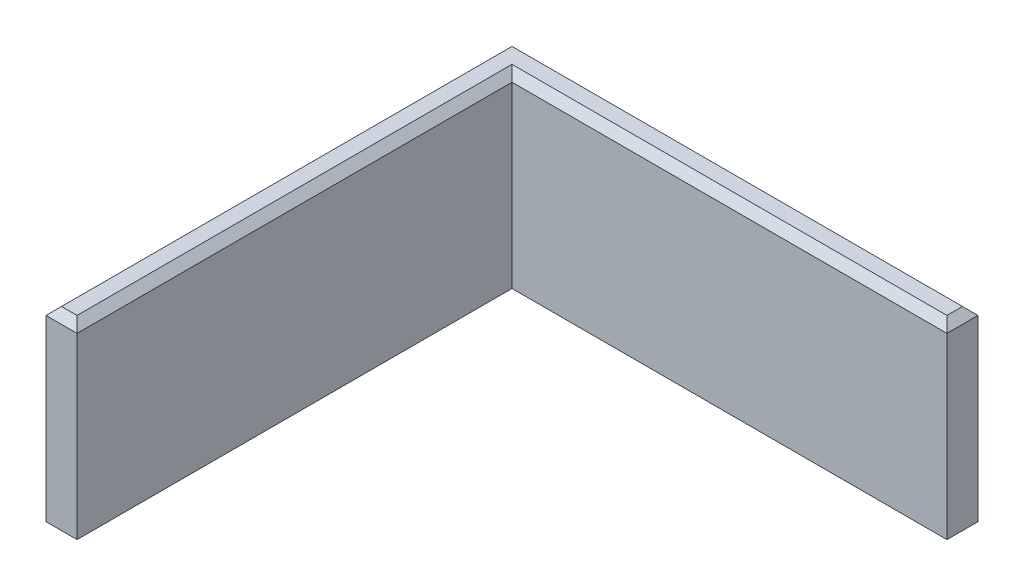
ISO-10303-21;
HEADER;
FILE_DESCRIPTION(('STEP AP214'),'2;1');
FILE_NAME('part.step','',(''),(''),'','','');
FILE_SCHEMA(('AUTOMOTIVE_DESIGN { 1 0 10303 214 1 1 1 1 }'));
ENDSEC;
DATA;
#1=APPLICATION_CONTEXT('core data for automotive mechanical design processes');
#2=APPLICATION_PROTOCOL_DEFINITION('international standard','automotive_design',2000,#1);
#3=PRODUCT_CONTEXT('',#1,'mechanical');
#4=PRODUCT('Part','Part','',(#3));
#5=PRODUCT_RELATED_PRODUCT_CATEGORY('part','',(#4));
#6=PRODUCT_DEFINITION_FORMATION('','',#4);
#7=PRODUCT_DEFINITION_CONTEXT('part definition',#1,'design');
#8=PRODUCT_DEFINITION('design','',#6,#7);
#9=PRODUCT_DEFINITION_SHAPE('','',#8);
#10=(LENGTH_UNIT() NAMED_UNIT(*) SI_UNIT(.MILLI.,.METRE.));
#11=(NAMED_UNIT(*) PLANE_ANGLE_UNIT() SI_UNIT($,.RADIAN.));
#12=(NAMED_UNIT(*) SI_UNIT($,.STERADIAN.) SOLID_ANGLE_UNIT());
#13=UNCERTAINTY_MEASURE_WITH_UNIT(LENGTH_MEASURE(1.E-05),#10,'distance_accuracy_value','');
#14=(GEOMETRIC_REPRESENTATION_CONTEXT(3) GLOBAL_UNCERTAINTY_ASSIGNED_CONTEXT((#13)) GLOBAL_UNIT_ASSIGNED_CONTEXT((#10,
#11,#12)) REPRESENTATION_CONTEXT('',''));
#15=CARTESIAN_POINT('',(0.,0.,0.));
#16=DIRECTION('',(0.,0.,1.));
#17=DIRECTION('',(1.,0.,0.));
#18=AXIS2_PLACEMENT_3D('',#15,#16,#17);
#19=CARTESIAN_POINT('',(0.,25.,0.));
#20=DIRECTION('',(0.,0.,-1.));
#21=DIRECTION('',(-1.,0.,0.));
#22=AXIS2_PLACEMENT_3D('',#19,#20,#21);
#23=PLANE('',#22);
#24=DIRECTION('',(0.,-1.,0.));
#25=VECTOR('',#24,1.);
#26=CARTESIAN_POINT('',(56.,25.,0.));
#27=LINE('',#26,#25);
#28=CARTESIAN_POINT('',(56.,24.,0.));
#29=VERTEX_POINT('',#28);
#30=CARTESIAN_POINT('',(56.,0.999999999999987,0.));
#31=VERTEX_POINT('',#30);
#32=EDGE_CURVE('E174',#29,#31,#27,.T.);
#33=ORIENTED_EDGE('',*,*,#32,.F.);
#34=DIRECTION('',(-1.,0.,0.));
#35=VECTOR('',#34,1.);
#36=CARTESIAN_POINT('',(0.,24.,0.));
#37=LINE('',#36,#35);
#38=CARTESIAN_POINT('',(0.,24.,0.));
#39=VERTEX_POINT('',#38);
#40=EDGE_CURVE('E209',#29,#39,#37,.T.);
#41=ORIENTED_EDGE('',*,*,#40,.T.);
#42=DIRECTION('',(0.,-1.,0.));
#43=VECTOR('',#42,1.);
#44=CARTESIAN_POINT('',(0.,25.,0.));
#45=LINE('',#44,#43);
#46=CARTESIAN_POINT('',(0.,0.999999999999987,0.));
#47=VERTEX_POINT('',#46);
#48=EDGE_CURVE('E167',#39,#47,#45,.T.);
#49=ORIENTED_EDGE('',*,*,#48,.T.);
#50=DIRECTION('',(1.,0.,0.));
#51=VECTOR('',#50,1.);
#52=CARTESIAN_POINT('',(0.,0.999999999999987,0.));
#53=LINE('',#52,#51);
#54=EDGE_CURVE('E206',#47,#31,#53,.T.);
#55=ORIENTED_EDGE('',*,*,#54,.T.);
#56=EDGE_LOOP('',(#33,#41,#49,#55));
#57=FACE_BOUND('',#56,.T.);
#58=ADVANCED_FACE('F47',(#57),#23,.F.);
#59=CARTESIAN_POINT('',(56.,25.,0.));
#60=DIRECTION('',(-1.,0.,0.));
#61=DIRECTION('',(0.,0.,1.));
#62=AXIS2_PLACEMENT_3D('',#59,#60,#61);
#63=PLANE('',#62);
#64=DIRECTION('',(0.,-1.,0.));
#65=VECTOR('',#64,1.);
#66=CARTESIAN_POINT('',(56.,25.,-4.00000000000001));
#67=LINE('',#66,#65);
#68=CARTESIAN_POINT('',(56.,24.,-4.00000000000001));
#69=VERTEX_POINT('',#68);
#70=CARTESIAN_POINT('',(56.,0.999999999999987,-4.00000000000001));
#71=VERTEX_POINT('',#70);
#72=EDGE_CURVE('E180',#69,#71,#67,.T.);
#73=ORIENTED_EDGE('',*,*,#72,.F.);
#74=DIRECTION('',(0.,0.,1.));
#75=VECTOR('',#74,1.);
#76=CARTESIAN_POINT('',(56.,24.,0.));
#77=LINE('',#76,#75);
#78=EDGE_CURVE('E165',#69,#29,#77,.T.);
#79=ORIENTED_EDGE('',*,*,#78,.T.);
#80=ORIENTED_EDGE('',*,*,#32,.T.);
#81=DIRECTION('',(0.,0.,-1.));
#82=VECTOR('',#81,1.);
#83=CARTESIAN_POINT('',(56.,0.999999999999987,0.));
#84=LINE('',#83,#82);
#85=EDGE_CURVE('E212',#31,#71,#84,.T.);
#86=ORIENTED_EDGE('',*,*,#85,.T.);
#87=EDGE_LOOP('',(#73,#79,#80,#86));
#88=FACE_BOUND('',#87,.T.);
#89=ADVANCED_FACE('F355',(#88),#63,.F.);
#90=CARTESIAN_POINT('',(-3.99999999999996,25.,-4.));
#91=DIRECTION('',(0.,0.,1.));
#92=DIRECTION('',(1.,0.,0.));
#93=AXIS2_PLACEMENT_3D('',#90,#91,#92);
#94=PLANE('',#93);
#95=DIRECTION('',(-1.,0.,0.));
#96=VECTOR('',#95,1.);
#97=CARTESIAN_POINT('',(-3.99999999999996,0.999999999999987,-4.));
#98=LINE('',#97,#96);
#99=CARTESIAN_POINT('',(-2.,0.999999999999987,-4.));
#100=VERTEX_POINT('',#99);
#101=EDGE_CURVE('E224',#71,#100,#98,.T.);
#102=ORIENTED_EDGE('',*,*,#101,.T.);
#103=DIRECTION('',(0.,-1.,0.));
#104=VECTOR('',#103,1.);
#105=CARTESIAN_POINT('',(-2.,25.,-4.));
#106=LINE('',#105,#104);
#107=CARTESIAN_POINT('',(-2.,24.,-4.));
#108=VERTEX_POINT('',#107);
#109=EDGE_CURVE('E70',#100,#108,#106,.F.);
#110=ORIENTED_EDGE('',*,*,#109,.T.);
#111=DIRECTION('',(1.,0.,0.));
#112=VECTOR('',#111,1.);
#113=CARTESIAN_POINT('',(56.,24.,-4.00000000000001));
#114=LINE('',#113,#112);
#115=EDGE_CURVE('E227',#108,#69,#114,.T.);
#116=ORIENTED_EDGE('',*,*,#115,.T.);
#117=ORIENTED_EDGE('',*,*,#72,.T.);
#118=EDGE_LOOP('',(#102,#110,#116,#117));
#119=FACE_BOUND('',#118,.T.);
#120=ADVANCED_FACE('F306',(#119),#94,.F.);
#121=CARTESIAN_POINT('',(-4.,25.,0.));
#122=DIRECTION('',(1.,0.,0.));
#123=DIRECTION('',(0.,0.,-1.));
#124=AXIS2_PLACEMENT_3D('',#121,#122,#123);
#125=PLANE('',#124);
#126=DIRECTION('',(0.,0.,-1.));
#127=VECTOR('',#126,1.);
#128=CARTESIAN_POINT('',(-4.,24.,-4.));
#129=LINE('',#128,#127);
#130=CARTESIAN_POINT('',(-3.99999999999998,24.,56.));
#131=VERTEX_POINT('',#130);
#132=CARTESIAN_POINT('',(-4.,24.,-2.));
#133=VERTEX_POINT('',#132);
#134=EDGE_CURVE('E220',#131,#133,#129,.T.);
#135=ORIENTED_EDGE('',*,*,#134,.T.);
#136=DIRECTION('',(0.,-1.,0.));
#137=VECTOR('',#136,1.);
#138=CARTESIAN_POINT('',(-4.,25.,-2.));
#139=LINE('',#138,#137);
#140=CARTESIAN_POINT('',(-4.,0.999999999999987,-2.));
#141=VERTEX_POINT('',#140);
#142=EDGE_CURVE('E249',#133,#141,#139,.T.);
#143=ORIENTED_EDGE('',*,*,#142,.T.);
#144=DIRECTION('',(0.,0.,1.));
#145=VECTOR('',#144,1.);
#146=CARTESIAN_POINT('',(-4.,0.999999999999987,0.));
#147=LINE('',#146,#145);
#148=CARTESIAN_POINT('',(-3.99999999999998,0.999999999999987,56.));
#149=VERTEX_POINT('',#148);
#150=EDGE_CURVE('E217',#141,#149,#147,.T.);
#151=ORIENTED_EDGE('',*,*,#150,.T.);
#152=DIRECTION('',(0.,-1.,0.));
#153=VECTOR('',#152,1.);
#154=CARTESIAN_POINT('',(-3.99999999999998,25.,56.));
#155=LINE('',#154,#153);
#156=EDGE_CURVE('E320',#131,#149,#155,.T.);
#157=ORIENTED_EDGE('',*,*,#156,.F.);
#158=EDGE_LOOP('',(#135,#143,#151,#157));
#159=FACE_BOUND('',#158,.T.);
#160=ADVANCED_FACE('F317',(#159),#125,.F.);
#161=CARTESIAN_POINT('',(0.,25.,56.));
#162=DIRECTION('',(0.,0.,-1.));
#163=DIRECTION('',(-1.,0.,0.));
#164=AXIS2_PLACEMENT_3D('',#161,#162,#163);
#165=PLANE('',#164);
#166=DIRECTION('',(0.,-1.,0.));
#167=VECTOR('',#166,1.);
#168=CARTESIAN_POINT('',(0.,25.,56.));
#169=LINE('',#168,#167);
#170=CARTESIAN_POINT('',(0.,24.,56.));
#171=VERTEX_POINT('',#170);
#172=CARTESIAN_POINT('',(0.,0.999999999999987,56.));
#173=VERTEX_POINT('',#172);
#174=EDGE_CURVE('E324',#171,#173,#169,.T.);
#175=ORIENTED_EDGE('',*,*,#174,.F.);
#176=DIRECTION('',(-1.,0.,0.));
#177=VECTOR('',#176,1.);
#178=CARTESIAN_POINT('',(-3.99999999999998,24.,56.));
#179=LINE('',#178,#177);
#180=EDGE_CURVE('E196',#171,#131,#179,.T.);
#181=ORIENTED_EDGE('',*,*,#180,.T.);
#182=ORIENTED_EDGE('',*,*,#156,.T.);
#183=DIRECTION('',(1.,0.,0.));
#184=VECTOR('',#183,1.);
#185=CARTESIAN_POINT('',(0.,0.999999999999987,56.));
#186=LINE('',#185,#184);
#187=EDGE_CURVE('E193',#149,#173,#186,.T.);
#188=ORIENTED_EDGE('',*,*,#187,.T.);
#189=EDGE_LOOP('',(#175,#181,#182,#188));
#190=FACE_BOUND('',#189,.T.);
#191=ADVANCED_FACE('F366',(#190),#165,.F.);
#192=CARTESIAN_POINT('',(0.,25.,0.));
#193=DIRECTION('',(-1.,0.,0.));
#194=DIRECTION('',(0.,0.,1.));
#195=AXIS2_PLACEMENT_3D('',#192,#193,#194);
#196=PLANE('',#195);
#197=ORIENTED_EDGE('',*,*,#48,.F.);
#198=DIRECTION('',(0.,0.,1.));
#199=VECTOR('',#198,1.);
#200=CARTESIAN_POINT('',(0.,24.,56.));
#201=LINE('',#200,#199);
#202=EDGE_CURVE('E203',#39,#171,#201,.T.);
#203=ORIENTED_EDGE('',*,*,#202,.T.);
#204=ORIENTED_EDGE('',*,*,#174,.T.);
#205=DIRECTION('',(0.,0.,-1.));
#206=VECTOR('',#205,1.);
#207=CARTESIAN_POINT('',(0.,0.999999999999987,0.));
#208=LINE('',#207,#206);
#209=EDGE_CURVE('E200',#173,#47,#208,.T.);
#210=ORIENTED_EDGE('',*,*,#209,.T.);
#211=EDGE_LOOP('',(#197,#203,#204,#210));
#212=FACE_BOUND('',#211,.T.);
#213=ADVANCED_FACE('F364',(#212),#196,.F.);
#214=CARTESIAN_POINT('',(0.,25.,0.));
#215=DIRECTION('',(0.,1.,0.));
#216=DIRECTION('',(0.,0.,1.));
#217=AXIS2_PLACEMENT_3D('',#214,#215,#216);
#218=PLANE('',#217);
#219=DIRECTION('',(0.,0.,1.));
#220=VECTOR('',#219,1.);
#221=CARTESIAN_POINT('',(-3.,25.,56.));
#222=LINE('',#221,#220);
#223=CARTESIAN_POINT('',(-3.00000000000001,25.,-3.00000000000001));
#224=VERTEX_POINT('',#223);
#225=CARTESIAN_POINT('',(-3.,25.,55.));
#226=VERTEX_POINT('',#225);
#227=EDGE_CURVE('E159',#224,#226,#222,.T.);
#228=ORIENTED_EDGE('',*,*,#227,.T.);
#229=DIRECTION('',(1.,0.,0.));
#230=VECTOR('',#229,1.);
#231=CARTESIAN_POINT('',(0.,25.,55.));
#232=LINE('',#231,#230);
#233=CARTESIAN_POINT('',(-0.999999999999969,25.,55.));
#234=VERTEX_POINT('',#233);
#235=EDGE_CURVE('E189',#226,#234,#232,.T.);
#236=ORIENTED_EDGE('',*,*,#235,.T.);
#237=DIRECTION('',(0.,0.,-1.));
#238=VECTOR('',#237,1.);
#239=CARTESIAN_POINT('',(-0.999999999999986,25.,0.));
#240=LINE('',#239,#238);
#241=CARTESIAN_POINT('',(-0.999999999999987,25.,-0.999999999999987));
#242=VERTEX_POINT('',#241);
#243=EDGE_CURVE('E186',#234,#242,#240,.T.);
#244=ORIENTED_EDGE('',*,*,#243,.T.);
#245=DIRECTION('',(1.,0.,0.));
#246=VECTOR('',#245,1.);
#247=CARTESIAN_POINT('',(56.,25.,-0.999999999999987));
#248=LINE('',#247,#246);
#249=CARTESIAN_POINT('',(55.,25.,-0.999999999999987));
#250=VERTEX_POINT('',#249);
#251=EDGE_CURVE('E154',#242,#250,#248,.T.);
#252=ORIENTED_EDGE('',*,*,#251,.T.);
#253=DIRECTION('',(0.,0.,-1.));
#254=VECTOR('',#253,1.);
#255=CARTESIAN_POINT('',(55.,25.,-4.00000000000001));
#256=LINE('',#255,#254);
#257=CARTESIAN_POINT('',(55.,25.,-3.00000000000002));
#258=VERTEX_POINT('',#257);
#259=EDGE_CURVE('E148',#250,#258,#256,.T.);
#260=ORIENTED_EDGE('',*,*,#259,.T.);
#261=DIRECTION('',(-1.,0.,0.));
#262=VECTOR('',#261,1.);
#263=CARTESIAN_POINT('',(-3.99999999999996,25.,-3.00000000000001));
#264=LINE('',#263,#262);
#265=EDGE_CURVE('E152',#258,#224,#264,.T.);
#266=ORIENTED_EDGE('',*,*,#265,.T.);
#267=EDGE_LOOP('',(#228,#236,#244,#252,#260,#266));
#268=FACE_BOUND('',#267,.T.);
#269=ADVANCED_FACE('F150',(#268),#218,.T.);
#270=CARTESIAN_POINT('',(0.,0.,0.));
#271=DIRECTION('',(0.,1.,0.));
#272=DIRECTION('',(0.,0.,1.));
#273=AXIS2_PLACEMENT_3D('',#270,#271,#272);
#274=PLANE('',#273);
#275=DIRECTION('',(0.,0.,-1.));
#276=VECTOR('',#275,1.);
#277=CARTESIAN_POINT('',(-3.00000000000001,0.,0.));
#278=LINE('',#277,#276);
#279=CARTESIAN_POINT('',(-3.,0.,55.));
#280=VERTEX_POINT('',#279);
#281=CARTESIAN_POINT('',(-3.00000000000001,0.,-3.00000000000001));
#282=VERTEX_POINT('',#281);
#283=EDGE_CURVE('E236',#280,#282,#278,.T.);
#284=ORIENTED_EDGE('',*,*,#283,.T.);
#285=DIRECTION('',(1.,0.,0.));
#286=VECTOR('',#285,1.);
#287=CARTESIAN_POINT('',(0.,0.,-3.00000000000001));
#288=LINE('',#287,#286);
#289=CARTESIAN_POINT('',(55.,0.,-3.00000000000002));
#290=VERTEX_POINT('',#289);
#291=EDGE_CURVE('E245',#282,#290,#288,.T.);
#292=ORIENTED_EDGE('',*,*,#291,.T.);
#293=DIRECTION('',(0.,0.,1.));
#294=VECTOR('',#293,1.);
#295=CARTESIAN_POINT('',(55.,0.,0.));
#296=LINE('',#295,#294);
#297=CARTESIAN_POINT('',(55.,0.,-0.999999999999987));
#298=VERTEX_POINT('',#297);
#299=EDGE_CURVE('E242',#290,#298,#296,.T.);
#300=ORIENTED_EDGE('',*,*,#299,.T.);
#301=DIRECTION('',(-1.,0.,0.));
#302=VECTOR('',#301,1.);
#303=CARTESIAN_POINT('',(0.,0.,-0.999999999999987));
#304=LINE('',#303,#302);
#305=CARTESIAN_POINT('',(-0.999999999999987,0.,-0.999999999999987));
#306=VERTEX_POINT('',#305);
#307=EDGE_CURVE('E239',#298,#306,#304,.T.);
#308=ORIENTED_EDGE('',*,*,#307,.T.);
#309=DIRECTION('',(0.,0.,1.));
#310=VECTOR('',#309,1.);
#311=CARTESIAN_POINT('',(-0.999999999999986,0.,0.));
#312=LINE('',#311,#310);
#313=CARTESIAN_POINT('',(-0.999999999999969,0.,55.));
#314=VERTEX_POINT('',#313);
#315=EDGE_CURVE('E230',#306,#314,#312,.T.);
#316=ORIENTED_EDGE('',*,*,#315,.T.);
#317=DIRECTION('',(-1.,0.,0.));
#318=VECTOR('',#317,1.);
#319=CARTESIAN_POINT('',(0.,0.,55.));
#320=LINE('',#319,#318);
#321=EDGE_CURVE('E233',#314,#280,#320,.T.);
#322=ORIENTED_EDGE('',*,*,#321,.T.);
#323=EDGE_LOOP('',(#284,#292,#300,#308,#316,#322));
#324=FACE_BOUND('',#323,.T.);
#325=ADVANCED_FACE('F393',(#324),#274,.F.);
#326=CARTESIAN_POINT('',(55.,25.,0.));
#327=DIRECTION('',(0.707106781186552,0.707106781186543,0.));
#328=DIRECTION('',(0.,0.,1.));
#329=AXIS2_PLACEMENT_3D('',#326,#327,#328);
#330=PLANE('',#329);
#331=DIRECTION('',(0.577350269189623,-0.577350269189631,0.577350269189623));
#332=VECTOR('',#331,1.);
#333=CARTESIAN_POINT('',(55.3333333333334,24.6666666666667,-0.666666666666661));
#334=LINE('',#333,#332);
#335=EDGE_CURVE('E168',#29,#250,#334,.F.);
#336=ORIENTED_EDGE('',*,*,#335,.F.);
#337=ORIENTED_EDGE('',*,*,#78,.F.);
#338=DIRECTION('',(0.577350269189623,-0.577350269189631,-0.577350269189623));
#339=VECTOR('',#338,1.);
#340=CARTESIAN_POINT('',(36.6666666666669,43.3333333333334,15.3333333333332));
#341=LINE('',#340,#339);
#342=EDGE_CURVE('E163',#258,#69,#341,.T.);
#343=ORIENTED_EDGE('',*,*,#342,.F.);
#344=ORIENTED_EDGE('',*,*,#259,.F.);
#345=EDGE_LOOP('',(#336,#337,#343,#344));
#346=FACE_BOUND('',#345,.T.);
#347=ADVANCED_FACE('F164',(#346),#330,.T.);
#348=CARTESIAN_POINT('',(0.,25.,-3.00000000000001));
#349=DIRECTION('',(0.,0.707106781186543,-0.707106781186552));
#350=DIRECTION('',(1.,0.,0.));
#351=AXIS2_PLACEMENT_3D('',#348,#349,#350);
#352=PLANE('',#351);
#353=ORIENTED_EDGE('',*,*,#115,.F.);
#354=CARTESIAN_POINT('',(-2.,26.,-2.));
#355=DIRECTION('',(0.,0.707106781186543,-0.707106781186552));
#356=DIRECTION('',(0.,-0.707106781186552,-0.707106781186543));
#357=AXIS2_PLACEMENT_3D('',#354,#355,#356);
#358=ELLIPSE('',#357,2.82842712474621,2.);
#359=CARTESIAN_POINT('',(-3.4142135623731,24.5857864376269,-3.41421356237309));
#360=VERTEX_POINT('',#359);
#361=EDGE_CURVE('E56',#108,#360,#358,.T.);
#362=ORIENTED_EDGE('',*,*,#361,.T.);
#363=DIRECTION('',(0.577350269189623,0.577350269189631,0.577350269189623));
#364=VECTOR('',#363,1.);
#365=CARTESIAN_POINT('',(-2.00000000000002,26.,-2.00000000000002));
#366=LINE('',#365,#364);
#367=EDGE_CURVE('E171',#224,#360,#366,.F.);
#368=ORIENTED_EDGE('',*,*,#367,.F.);
#369=ORIENTED_EDGE('',*,*,#265,.F.);
#370=ORIENTED_EDGE('',*,*,#342,.T.);
#371=EDGE_LOOP('',(#353,#362,#368,#369,#370));
#372=FACE_BOUND('',#371,.T.);
#373=ADVANCED_FACE('F170',(#372),#352,.T.);
#374=CARTESIAN_POINT('',(0.,25.,-0.999999999999987));
#375=DIRECTION('',(0.,0.707106781186543,0.707106781186552));
#376=DIRECTION('',(-1.,0.,0.));
#377=AXIS2_PLACEMENT_3D('',#374,#375,#376);
#378=PLANE('',#377);
#379=ORIENTED_EDGE('',*,*,#335,.T.);
#380=ORIENTED_EDGE('',*,*,#251,.F.);
#381=DIRECTION('',(0.577350269189623,-0.577350269189631,0.577350269189623));
#382=VECTOR('',#381,1.);
#383=CARTESIAN_POINT('',(-0.666666666666661,24.6666666666667,-0.666666666666661));
#384=LINE('',#383,#382);
#385=EDGE_CURVE('E257',#39,#242,#384,.F.);
#386=ORIENTED_EDGE('',*,*,#385,.F.);
#387=ORIENTED_EDGE('',*,*,#40,.F.);
#388=EDGE_LOOP('',(#379,#380,#386,#387));
#389=FACE_BOUND('',#388,.T.);
#390=ADVANCED_FACE('F357',(#389),#378,.T.);
#391=CARTESIAN_POINT('',(-3.00000000000001,25.,0.));
#392=DIRECTION('',(-0.707106781186552,0.707106781186543,0.));
#393=DIRECTION('',(0.,0.,-1.));
#394=AXIS2_PLACEMENT_3D('',#391,#392,#393);
#395=PLANE('',#394);
#396=ORIENTED_EDGE('',*,*,#367,.T.);
#397=CARTESIAN_POINT('',(-2.,26.,-2.));
#398=DIRECTION('',(-0.707106781186552,0.707106781186543,0.));
#399=DIRECTION('',(-0.707106781186543,-0.707106781186552,0.));
#400=AXIS2_PLACEMENT_3D('',#397,#398,#399);
#401=ELLIPSE('',#400,2.82842712474621,2.);
#402=EDGE_CURVE('E11',#360,#133,#401,.T.);
#403=ORIENTED_EDGE('',*,*,#402,.T.);
#404=ORIENTED_EDGE('',*,*,#134,.F.);
#405=DIRECTION('',(0.577350269189623,0.577350269189631,-0.577350269189623));
#406=VECTOR('',#405,1.);
#407=CARTESIAN_POINT('',(15.3333333333332,43.3333333333334,36.6666666666668));
#408=LINE('',#407,#406);
#409=EDGE_CURVE('E253',#226,#131,#408,.F.);
#410=ORIENTED_EDGE('',*,*,#409,.F.);
#411=ORIENTED_EDGE('',*,*,#227,.F.);
#412=EDGE_LOOP('',(#396,#403,#404,#410,#411));
#413=FACE_BOUND('',#412,.T.);
#414=ADVANCED_FACE('F313',(#413),#395,.T.);
#415=CARTESIAN_POINT('',(-0.999999999999986,25.,0.));
#416=DIRECTION('',(0.707106781186553,0.707106781186542,0.));
#417=DIRECTION('',(0.,0.,1.));
#418=AXIS2_PLACEMENT_3D('',#415,#416,#417);
#419=PLANE('',#418);
#420=ORIENTED_EDGE('',*,*,#385,.T.);
#421=ORIENTED_EDGE('',*,*,#243,.F.);
#422=DIRECTION('',(0.577350269189623,-0.577350269189631,0.577350269189623));
#423=VECTOR('',#422,1.);
#424=CARTESIAN_POINT('',(-19.3333333333331,43.3333333333334,36.6666666666668));
#425=LINE('',#424,#423);
#426=EDGE_CURVE('E250',#171,#234,#425,.F.);
#427=ORIENTED_EDGE('',*,*,#426,.F.);
#428=ORIENTED_EDGE('',*,*,#202,.F.);
#429=EDGE_LOOP('',(#420,#421,#427,#428));
#430=FACE_BOUND('',#429,.T.);
#431=ADVANCED_FACE('F362',(#430),#419,.T.);
#432=CARTESIAN_POINT('',(0.,25.,55.));
#433=DIRECTION('',(0.,0.707106781186543,0.707106781186552));
#434=DIRECTION('',(-1.,0.,0.));
#435=AXIS2_PLACEMENT_3D('',#432,#433,#434);
#436=PLANE('',#435);
#437=ORIENTED_EDGE('',*,*,#409,.T.);
#438=ORIENTED_EDGE('',*,*,#180,.F.);
#439=ORIENTED_EDGE('',*,*,#426,.T.);
#440=ORIENTED_EDGE('',*,*,#235,.F.);
#441=EDGE_LOOP('',(#437,#438,#439,#440));
#442=FACE_BOUND('',#441,.T.);
#443=ADVANCED_FACE('F368',(#442),#436,.T.);
#444=CARTESIAN_POINT('',(0.,0.999999999999987,0.));
#445=DIRECTION('',(-0.707106781186548,0.707106781186547,0.));
#446=DIRECTION('',(0.,0.,-1.));
#447=AXIS2_PLACEMENT_3D('',#444,#445,#446);
#448=PLANE('',#447);
#449=DIRECTION('',(-0.577350269189626,-0.577350269189626,-0.577350269189626));
#450=VECTOR('',#449,1.);
#451=CARTESIAN_POINT('',(-18.6666666666667,-17.6666666666667,37.3333333333333));
#452=LINE('',#451,#450);
#453=EDGE_CURVE('E280',#314,#173,#452,.F.);
#454=ORIENTED_EDGE('',*,*,#453,.F.);
#455=ORIENTED_EDGE('',*,*,#315,.F.);
#456=DIRECTION('',(0.577350269189626,0.577350269189626,0.577350269189626));
#457=VECTOR('',#456,1.);
#458=CARTESIAN_POINT('',(0.,0.999999999999987,0.));
#459=LINE('',#458,#457);
#460=EDGE_CURVE('E254',#47,#306,#459,.F.);
#461=ORIENTED_EDGE('',*,*,#460,.F.);
#462=ORIENTED_EDGE('',*,*,#209,.F.);
#463=EDGE_LOOP('',(#454,#455,#461,#462));
#464=FACE_BOUND('',#463,.T.);
#465=ADVANCED_FACE('F345',(#464),#448,.F.);
#466=CARTESIAN_POINT('',(0.,0.999999999999987,0.));
#467=DIRECTION('',(0.,0.707106781186547,-0.707106781186547));
#468=DIRECTION('',(1.,0.,0.));
#469=AXIS2_PLACEMENT_3D('',#466,#467,#468);
#470=PLANE('',#469);
#471=ORIENTED_EDGE('',*,*,#460,.T.);
#472=ORIENTED_EDGE('',*,*,#307,.F.);
#473=DIRECTION('',(0.577350269189626,0.577350269189626,0.577350269189626));
#474=VECTOR('',#473,1.);
#475=CARTESIAN_POINT('',(37.3333333333334,-17.6666666666667,-18.6666666666667));
#476=LINE('',#475,#474);
#477=EDGE_CURVE('E276',#31,#298,#476,.F.);
#478=ORIENTED_EDGE('',*,*,#477,.F.);
#479=ORIENTED_EDGE('',*,*,#54,.F.);
#480=EDGE_LOOP('',(#471,#472,#478,#479));
#481=FACE_BOUND('',#480,.T.);
#482=ADVANCED_FACE('F349',(#481),#470,.F.);
#483=CARTESIAN_POINT('',(0.,0.999999999999987,56.));
#484=DIRECTION('',(0.,0.707106781186547,-0.707106781186547));
#485=DIRECTION('',(1.,0.,0.));
#486=AXIS2_PLACEMENT_3D('',#483,#484,#485);
#487=PLANE('',#486);
#488=ORIENTED_EDGE('',*,*,#453,.T.);
#489=ORIENTED_EDGE('',*,*,#187,.F.);
#490=DIRECTION('',(0.577350269189626,-0.577350269189626,-0.577350269189626));
#491=VECTOR('',#490,1.);
#492=CARTESIAN_POINT('',(-2.66666666666665,-0.333333333333346,54.6666666666667));
#493=LINE('',#492,#491);
#494=EDGE_CURVE('E272',#280,#149,#493,.F.);
#495=ORIENTED_EDGE('',*,*,#494,.F.);
#496=ORIENTED_EDGE('',*,*,#321,.F.);
#497=EDGE_LOOP('',(#488,#489,#495,#496));
#498=FACE_BOUND('',#497,.T.);
#499=ADVANCED_FACE('F452',(#498),#487,.F.);
#500=CARTESIAN_POINT('',(56.,0.999999999999987,0.));
#501=DIRECTION('',(-0.707106781186547,0.707106781186547,0.));
#502=DIRECTION('',(0.,0.,-1.));
#503=AXIS2_PLACEMENT_3D('',#500,#501,#502);
#504=PLANE('',#503);
#505=ORIENTED_EDGE('',*,*,#477,.T.);
#506=ORIENTED_EDGE('',*,*,#299,.F.);
#507=DIRECTION('',(0.577350269189626,0.577350269189626,-0.577350269189626));
#508=VECTOR('',#507,1.);
#509=CARTESIAN_POINT('',(54.6666666666667,-0.333333333333349,-2.66666666666667));
#510=LINE('',#509,#508);
#511=EDGE_CURVE('E269',#71,#290,#510,.F.);
#512=ORIENTED_EDGE('',*,*,#511,.F.);
#513=ORIENTED_EDGE('',*,*,#85,.F.);
#514=EDGE_LOOP('',(#505,#506,#512,#513));
#515=FACE_BOUND('',#514,.T.);
#516=ADVANCED_FACE('F353',(#515),#504,.F.);
#517=CARTESIAN_POINT('',(-4.,0.999999999999987,0.));
#518=DIRECTION('',(0.707106781186547,0.707106781186547,0.));
#519=DIRECTION('',(0.,0.,1.));
#520=AXIS2_PLACEMENT_3D('',#517,#518,#519);
#521=PLANE('',#520);
#522=ORIENTED_EDGE('',*,*,#150,.F.);
#523=CARTESIAN_POINT('',(-2.,-1.00000000000001,-2.));
#524=DIRECTION('',(0.707106781186547,0.707106781186547,0.));
#525=DIRECTION('',(0.707106781186548,-0.707106781186548,0.));
#526=AXIS2_PLACEMENT_3D('',#523,#524,#525);
#527=ELLIPSE('',#526,2.82842712474619,2.);
#528=CARTESIAN_POINT('',(-3.4142135623731,0.414213562373083,-3.4142135623731));
#529=VERTEX_POINT('',#528);
#530=EDGE_CURVE('E290',#141,#529,#527,.F.);
#531=ORIENTED_EDGE('',*,*,#530,.T.);
#532=DIRECTION('',(0.577350269189626,-0.577350269189626,0.577350269189626));
#533=VECTOR('',#532,1.);
#534=CARTESIAN_POINT('',(-2.66666666666667,-0.333333333333346,-2.66666666666667));
#535=LINE('',#534,#533);
#536=EDGE_CURVE('E265',#282,#529,#535,.F.);
#537=ORIENTED_EDGE('',*,*,#536,.F.);
#538=ORIENTED_EDGE('',*,*,#283,.F.);
#539=ORIENTED_EDGE('',*,*,#494,.T.);
#540=EDGE_LOOP('',(#522,#531,#537,#538,#539));
#541=FACE_BOUND('',#540,.T.);
#542=ADVANCED_FACE('F470',(#541),#521,.F.);
#543=CARTESIAN_POINT('',(-3.99999999999996,0.999999999999987,-4.));
#544=DIRECTION('',(0.,0.707106781186547,0.707106781186547));
#545=DIRECTION('',(-1.,0.,0.));
#546=AXIS2_PLACEMENT_3D('',#543,#544,#545);
#547=PLANE('',#546);
#548=ORIENTED_EDGE('',*,*,#536,.T.);
#549=CARTESIAN_POINT('',(-2.,-1.00000000000001,-2.));
#550=DIRECTION('',(0.,0.707106781186547,0.707106781186547));
#551=DIRECTION('',(0.,-0.707106781186548,0.707106781186548));
#552=AXIS2_PLACEMENT_3D('',#549,#550,#551);
#553=ELLIPSE('',#552,2.82842712474619,2.);
#554=EDGE_CURVE('E293',#529,#100,#553,.F.);
#555=ORIENTED_EDGE('',*,*,#554,.T.);
#556=ORIENTED_EDGE('',*,*,#101,.F.);
#557=ORIENTED_EDGE('',*,*,#511,.T.);
#558=ORIENTED_EDGE('',*,*,#291,.F.);
#559=EDGE_LOOP('',(#548,#555,#556,#557,#558));
#560=FACE_BOUND('',#559,.T.);
#561=ADVANCED_FACE('F301',(#560),#547,.F.);
#562=CARTESIAN_POINT('',(-2.,25.,-2.));
#563=DIRECTION('',(0.,-1.,0.));
#564=DIRECTION('',(0.,0.,-1.));
#565=AXIS2_PLACEMENT_3D('',#562,#563,#564);
#566=CYLINDRICAL_SURFACE('',#565,2.);
#567=ORIENTED_EDGE('',*,*,#361,.F.);
#568=ORIENTED_EDGE('',*,*,#109,.F.);
#569=ORIENTED_EDGE('',*,*,#554,.F.);
#570=ORIENTED_EDGE('',*,*,#530,.F.);
#571=ORIENTED_EDGE('',*,*,#142,.F.);
#572=ORIENTED_EDGE('',*,*,#402,.F.);
#573=EDGE_LOOP('',(#567,#568,#569,#570,#571,#572));
#574=FACE_BOUND('',#573,.T.);
#575=ADVANCED_FACE('F49',(#574),#566,.T.);
#576=CLOSED_SHELL('',(#58,#89,#120,#160,#191,#213,#269,#325,#347,#373,#390,#414,#431,#443,#465,
#482,#499,#516,#542,#561,#575));
#577=MANIFOLD_SOLID_BREP('B2',#576);
#578=ADVANCED_BREP_SHAPE_REPRESENTATION('',(#18,#577),#14);
#579=SHAPE_DEFINITION_REPRESENTATION(#9,#578);
ENDSEC;
END-ISO-10303-21;
